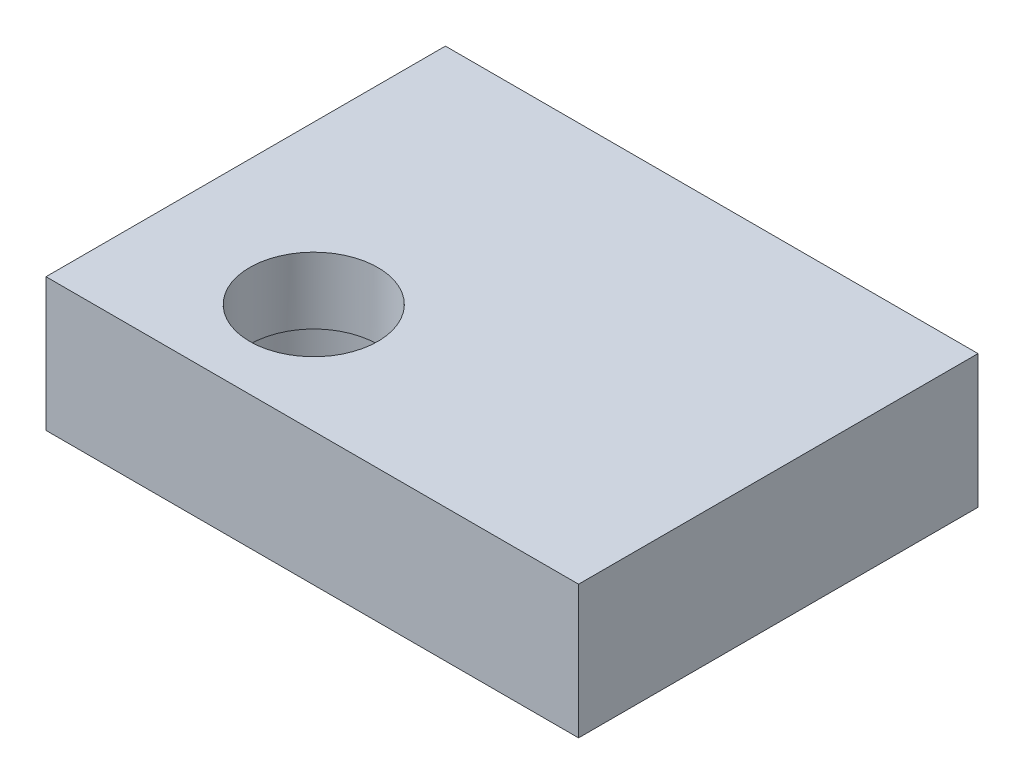
ISO-10303-21;
HEADER;
FILE_DESCRIPTION(('STEP AP214'),'2;1');
FILE_NAME('part.step','',(''),(''),'','','');
FILE_SCHEMA(('AUTOMOTIVE_DESIGN { 1 0 10303 214 1 1 1 1 }'));
ENDSEC;
DATA;
#1=APPLICATION_CONTEXT('core data for automotive mechanical design processes');
#2=APPLICATION_PROTOCOL_DEFINITION('international standard','automotive_design',2000,#1);
#3=PRODUCT_CONTEXT('',#1,'mechanical');
#4=PRODUCT('Part','Part','',(#3));
#5=PRODUCT_RELATED_PRODUCT_CATEGORY('part','',(#4));
#6=PRODUCT_DEFINITION_FORMATION('','',#4);
#7=PRODUCT_DEFINITION_CONTEXT('part definition',#1,'design');
#8=PRODUCT_DEFINITION('design','',#6,#7);
#9=PRODUCT_DEFINITION_SHAPE('','',#8);
#10=(LENGTH_UNIT() NAMED_UNIT(*) SI_UNIT(.MILLI.,.METRE.));
#11=(NAMED_UNIT(*) PLANE_ANGLE_UNIT() SI_UNIT($,.RADIAN.));
#12=(NAMED_UNIT(*) SI_UNIT($,.STERADIAN.) SOLID_ANGLE_UNIT());
#13=UNCERTAINTY_MEASURE_WITH_UNIT(LENGTH_MEASURE(1.E-05),#10,'distance_accuracy_value','');
#14=(GEOMETRIC_REPRESENTATION_CONTEXT(3) GLOBAL_UNCERTAINTY_ASSIGNED_CONTEXT((#13)) GLOBAL_UNIT_ASSIGNED_CONTEXT((#10,
#11,#12)) REPRESENTATION_CONTEXT('',''));
#15=CARTESIAN_POINT('',(0.,0.,0.));
#16=DIRECTION('',(0.,0.,1.));
#17=DIRECTION('',(1.,0.,0.));
#18=AXIS2_PLACEMENT_3D('',#15,#16,#17);
#19=CARTESIAN_POINT('',(20.,10.,15.));
#20=DIRECTION('',(-1.,0.,0.));
#21=DIRECTION('',(0.,0.,1.));
#22=AXIS2_PLACEMENT_3D('',#19,#20,#21);
#23=PLANE('',#22);
#24=DIRECTION('',(0.,0.,-1.));
#25=VECTOR('',#24,1.);
#26=CARTESIAN_POINT('',(20.,0.,15.));
#27=LINE('',#26,#25);
#28=CARTESIAN_POINT('',(20.,0.,15.));
#29=VERTEX_POINT('',#28);
#30=CARTESIAN_POINT('',(20.,0.,-15.));
#31=VERTEX_POINT('',#30);
#32=EDGE_CURVE('E117',#29,#31,#27,.T.);
#33=ORIENTED_EDGE('',*,*,#32,.T.);
#34=DIRECTION('',(0.,-1.,0.));
#35=VECTOR('',#34,1.);
#36=CARTESIAN_POINT('',(20.,10.,-15.));
#37=LINE('',#36,#35);
#38=CARTESIAN_POINT('',(20.,10.,-15.));
#39=VERTEX_POINT('',#38);
#40=EDGE_CURVE('E11',#39,#31,#37,.T.);
#41=ORIENTED_EDGE('',*,*,#40,.F.);
#42=DIRECTION('',(0.,0.,-1.));
#43=VECTOR('',#42,1.);
#44=CARTESIAN_POINT('',(20.,10.,15.));
#45=LINE('',#44,#43);
#46=CARTESIAN_POINT('',(20.,10.,15.));
#47=VERTEX_POINT('',#46);
#48=EDGE_CURVE('E100',#47,#39,#45,.T.);
#49=ORIENTED_EDGE('',*,*,#48,.F.);
#50=DIRECTION('',(0.,-1.,0.));
#51=VECTOR('',#50,1.);
#52=CARTESIAN_POINT('',(20.,10.,15.));
#53=LINE('',#52,#51);
#54=EDGE_CURVE('E113',#47,#29,#53,.T.);
#55=ORIENTED_EDGE('',*,*,#54,.T.);
#56=EDGE_LOOP('',(#33,#41,#49,#55));
#57=FACE_BOUND('',#56,.T.);
#58=ADVANCED_FACE('F47',(#57),#23,.F.);
#59=CARTESIAN_POINT('',(-20.,10.,-15.));
#60=DIRECTION('',(0.,0.,1.));
#61=DIRECTION('',(1.,0.,0.));
#62=AXIS2_PLACEMENT_3D('',#59,#60,#61);
#63=PLANE('',#62);
#64=DIRECTION('',(-1.,0.,0.));
#65=VECTOR('',#64,1.);
#66=CARTESIAN_POINT('',(-20.,0.,-15.));
#67=LINE('',#66,#65);
#68=CARTESIAN_POINT('',(-20.,0.,-15.));
#69=VERTEX_POINT('',#68);
#70=EDGE_CURVE('E105',#31,#69,#67,.T.);
#71=ORIENTED_EDGE('',*,*,#70,.T.);
#72=DIRECTION('',(0.,-1.,0.));
#73=VECTOR('',#72,1.);
#74=CARTESIAN_POINT('',(-20.,10.,-15.));
#75=LINE('',#74,#73);
#76=CARTESIAN_POINT('',(-20.,10.,-15.));
#77=VERTEX_POINT('',#76);
#78=EDGE_CURVE('E57',#77,#69,#75,.T.);
#79=ORIENTED_EDGE('',*,*,#78,.F.);
#80=DIRECTION('',(-1.,0.,0.));
#81=VECTOR('',#80,1.);
#82=CARTESIAN_POINT('',(-20.,10.,-15.));
#83=LINE('',#82,#81);
#84=EDGE_CURVE('E95',#39,#77,#83,.T.);
#85=ORIENTED_EDGE('',*,*,#84,.F.);
#86=ORIENTED_EDGE('',*,*,#40,.T.);
#87=EDGE_LOOP('',(#71,#79,#85,#86));
#88=FACE_BOUND('',#87,.T.);
#89=ADVANCED_FACE('F104',(#88),#63,.F.);
#90=CARTESIAN_POINT('',(-20.,10.,15.));
#91=DIRECTION('',(1.,0.,0.));
#92=DIRECTION('',(0.,0.,-1.));
#93=AXIS2_PLACEMENT_3D('',#90,#91,#92);
#94=PLANE('',#93);
#95=DIRECTION('',(0.,0.,1.));
#96=VECTOR('',#95,1.);
#97=CARTESIAN_POINT('',(-20.,0.,15.));
#98=LINE('',#97,#96);
#99=CARTESIAN_POINT('',(-20.,0.,15.));
#100=VERTEX_POINT('',#99);
#101=EDGE_CURVE('E82',#69,#100,#98,.T.);
#102=ORIENTED_EDGE('',*,*,#101,.T.);
#103=DIRECTION('',(0.,-1.,0.));
#104=VECTOR('',#103,1.);
#105=CARTESIAN_POINT('',(-20.,10.,15.));
#106=LINE('',#105,#104);
#107=CARTESIAN_POINT('',(-20.,10.,15.));
#108=VERTEX_POINT('',#107);
#109=EDGE_CURVE('E107',#108,#100,#106,.T.);
#110=ORIENTED_EDGE('',*,*,#109,.F.);
#111=DIRECTION('',(0.,0.,1.));
#112=VECTOR('',#111,1.);
#113=CARTESIAN_POINT('',(-20.,10.,15.));
#114=LINE('',#113,#112);
#115=EDGE_CURVE('E98',#77,#108,#114,.T.);
#116=ORIENTED_EDGE('',*,*,#115,.F.);
#117=ORIENTED_EDGE('',*,*,#78,.T.);
#118=EDGE_LOOP('',(#102,#110,#116,#117));
#119=FACE_BOUND('',#118,.T.);
#120=ADVANCED_FACE('F109',(#119),#94,.F.);
#121=CARTESIAN_POINT('',(-20.,10.,15.));
#122=DIRECTION('',(0.,0.,-1.));
#123=DIRECTION('',(-1.,0.,0.));
#124=AXIS2_PLACEMENT_3D('',#121,#122,#123);
#125=PLANE('',#124);
#126=DIRECTION('',(1.,0.,0.));
#127=VECTOR('',#126,1.);
#128=CARTESIAN_POINT('',(-20.,0.,15.));
#129=LINE('',#128,#127);
#130=EDGE_CURVE('E88',#100,#29,#129,.T.);
#131=ORIENTED_EDGE('',*,*,#130,.T.);
#132=ORIENTED_EDGE('',*,*,#54,.F.);
#133=DIRECTION('',(1.,0.,0.));
#134=VECTOR('',#133,1.);
#135=CARTESIAN_POINT('',(-20.,10.,15.));
#136=LINE('',#135,#134);
#137=EDGE_CURVE('E65',#108,#47,#136,.T.);
#138=ORIENTED_EDGE('',*,*,#137,.F.);
#139=ORIENTED_EDGE('',*,*,#109,.T.);
#140=EDGE_LOOP('',(#131,#132,#138,#139));
#141=FACE_BOUND('',#140,.T.);
#142=ADVANCED_FACE('F131',(#141),#125,.F.);
#143=CARTESIAN_POINT('',(0.,10.,0.));
#144=DIRECTION('',(0.,-1.,0.));
#145=DIRECTION('',(0.,0.,-1.));
#146=AXIS2_PLACEMENT_3D('',#143,#144,#145);
#147=PLANE('',#146);
#148=CARTESIAN_POINT('',(-8.14,10.,6.75));
#149=DIRECTION('',(0.,1.,0.));
#150=DIRECTION('',(0.,0.,1.));
#151=AXIS2_PLACEMENT_3D('',#148,#149,#150);
#152=CIRCLE('',#151,4.8125);
#153=CARTESIAN_POINT('',(-8.14,10.,11.5625));
#154=VERTEX_POINT('',#153);
#155=EDGE_CURVE('E169',#154,#154,#152,.T.);
#156=ORIENTED_EDGE('',*,*,#155,.F.);
#157=EDGE_LOOP('',(#156));
#158=FACE_BOUND('',#157,.T.);
#159=ORIENTED_EDGE('',*,*,#48,.T.);
#160=ORIENTED_EDGE('',*,*,#84,.T.);
#161=ORIENTED_EDGE('',*,*,#115,.T.);
#162=ORIENTED_EDGE('',*,*,#137,.T.);
#163=EDGE_LOOP('',(#159,#160,#161,#162));
#164=FACE_BOUND('',#163,.T.);
#165=ADVANCED_FACE('F96',(#158,#164),#147,.F.);
#166=CARTESIAN_POINT('',(0.,0.,0.));
#167=DIRECTION('',(0.,-1.,0.));
#168=DIRECTION('',(0.,0.,-1.));
#169=AXIS2_PLACEMENT_3D('',#166,#167,#168);
#170=PLANE('',#169);
#171=CARTESIAN_POINT('',(-8.14,0.,6.75));
#172=DIRECTION('',(0.,-1.,0.));
#173=DIRECTION('',(0.,0.,-1.));
#174=AXIS2_PLACEMENT_3D('',#171,#172,#173);
#175=CIRCLE('',#174,6.3);
#176=CARTESIAN_POINT('',(-8.14,0.,0.449999999999997));
#177=VERTEX_POINT('',#176);
#178=EDGE_CURVE('E150',#177,#177,#175,.T.);
#179=ORIENTED_EDGE('',*,*,#178,.F.);
#180=EDGE_LOOP('',(#179));
#181=FACE_BOUND('',#180,.T.);
#182=CARTESIAN_POINT('',(-13.3333333333333,0.,-10.));
#183=DIRECTION('',(0.,-1.,0.));
#184=DIRECTION('',(0.,0.,-1.));
#185=AXIS2_PLACEMENT_3D('',#182,#183,#184);
#186=CIRCLE('',#185,2.);
#187=CARTESIAN_POINT('',(-13.3333333333333,0.,-12.));
#188=VERTEX_POINT('',#187);
#189=EDGE_CURVE('E158',#188,#188,#186,.T.);
#190=ORIENTED_EDGE('',*,*,#189,.F.);
#191=EDGE_LOOP('',(#190));
#192=FACE_BOUND('',#191,.T.);
#193=CARTESIAN_POINT('',(13.3333333333333,0.,-10.));
#194=DIRECTION('',(0.,-1.,0.));
#195=DIRECTION('',(0.,0.,1.));
#196=AXIS2_PLACEMENT_3D('',#193,#194,#195);
#197=CIRCLE('',#196,2.);
#198=CARTESIAN_POINT('',(13.3333333333333,0.,-8.));
#199=VERTEX_POINT('',#198);
#200=EDGE_CURVE('E142',#199,#199,#197,.T.);
#201=ORIENTED_EDGE('',*,*,#200,.F.);
#202=EDGE_LOOP('',(#201));
#203=FACE_BOUND('',#202,.T.);
#204=CARTESIAN_POINT('',(13.3333333333333,0.,10.));
#205=DIRECTION('',(0.,-1.,0.));
#206=DIRECTION('',(0.,0.,-1.));
#207=AXIS2_PLACEMENT_3D('',#204,#205,#206);
#208=CIRCLE('',#207,2.);
#209=CARTESIAN_POINT('',(13.3333333333333,0.,8.));
#210=VERTEX_POINT('',#209);
#211=EDGE_CURVE('E138',#210,#210,#208,.T.);
#212=ORIENTED_EDGE('',*,*,#211,.F.);
#213=EDGE_LOOP('',(#212));
#214=FACE_BOUND('',#213,.T.);
#215=ORIENTED_EDGE('',*,*,#32,.F.);
#216=ORIENTED_EDGE('',*,*,#130,.F.);
#217=ORIENTED_EDGE('',*,*,#101,.F.);
#218=ORIENTED_EDGE('',*,*,#70,.F.);
#219=EDGE_LOOP('',(#215,#216,#217,#218));
#220=FACE_BOUND('',#219,.T.);
#221=ADVANCED_FACE('F134',(#181,#192,#203,#214,#220),#170,.T.);
#222=CARTESIAN_POINT('',(13.3333333333333,5.,10.));
#223=DIRECTION('',(0.,-1.,0.));
#224=DIRECTION('',(0.,0.,-1.));
#225=AXIS2_PLACEMENT_3D('',#222,#223,#224);
#226=CYLINDRICAL_SURFACE('',#225,2.);
#227=CARTESIAN_POINT('',(13.3333333333333,5.,10.));
#228=DIRECTION('',(0.,-1.,0.));
#229=DIRECTION('',(0.,0.,-1.));
#230=AXIS2_PLACEMENT_3D('',#227,#228,#229);
#231=CIRCLE('',#230,2.);
#232=CARTESIAN_POINT('',(13.3333333333333,5.,8.));
#233=VERTEX_POINT('',#232);
#234=EDGE_CURVE('E121',#233,#233,#231,.T.);
#235=ORIENTED_EDGE('',*,*,#234,.F.);
#236=EDGE_LOOP('',(#235));
#237=FACE_BOUND('',#236,.T.);
#238=ORIENTED_EDGE('',*,*,#211,.T.);
#239=EDGE_LOOP('',(#238));
#240=FACE_BOUND('',#239,.T.);
#241=ADVANCED_FACE('F195',(#237,#240),#226,.F.);
#242=CARTESIAN_POINT('',(13.3333333333333,5.,10.));
#243=DIRECTION('',(0.,-1.,0.));
#244=DIRECTION('',(0.,0.,-1.));
#245=AXIS2_PLACEMENT_3D('',#242,#243,#244);
#246=PLANE('',#245);
#247=ORIENTED_EDGE('',*,*,#234,.T.);
#248=EDGE_LOOP('',(#247));
#249=FACE_BOUND('',#248,.T.);
#250=ADVANCED_FACE('F204',(#249),#246,.T.);
#251=CARTESIAN_POINT('',(13.3333333333333,5.,-10.));
#252=DIRECTION('',(0.,-1.,0.));
#253=DIRECTION('',(0.,0.,-1.));
#254=AXIS2_PLACEMENT_3D('',#251,#252,#253);
#255=CYLINDRICAL_SURFACE('',#254,2.);
#256=CARTESIAN_POINT('',(13.3333333333333,5.,-10.));
#257=DIRECTION('',(0.,-1.,0.));
#258=DIRECTION('',(0.,0.,1.));
#259=AXIS2_PLACEMENT_3D('',#256,#257,#258);
#260=CIRCLE('',#259,2.);
#261=CARTESIAN_POINT('',(13.3333333333333,5.,-8.));
#262=VERTEX_POINT('',#261);
#263=EDGE_CURVE('E162',#262,#262,#260,.T.);
#264=ORIENTED_EDGE('',*,*,#263,.F.);
#265=EDGE_LOOP('',(#264));
#266=FACE_BOUND('',#265,.T.);
#267=ORIENTED_EDGE('',*,*,#200,.T.);
#268=EDGE_LOOP('',(#267));
#269=FACE_BOUND('',#268,.T.);
#270=ADVANCED_FACE('F210',(#266,#269),#255,.F.);
#271=CARTESIAN_POINT('',(13.3333333333333,5.,-10.));
#272=DIRECTION('',(0.,1.,0.));
#273=DIRECTION('',(0.,0.,1.));
#274=AXIS2_PLACEMENT_3D('',#271,#272,#273);
#275=PLANE('',#274);
#276=ORIENTED_EDGE('',*,*,#263,.T.);
#277=EDGE_LOOP('',(#276));
#278=FACE_BOUND('',#277,.T.);
#279=ADVANCED_FACE('F268',(#278),#275,.F.);
#280=CARTESIAN_POINT('',(-13.3333333333333,5.,-10.));
#281=DIRECTION('',(0.,-1.,0.));
#282=DIRECTION('',(0.,0.,-1.));
#283=AXIS2_PLACEMENT_3D('',#280,#281,#282);
#284=CYLINDRICAL_SURFACE('',#283,2.);
#285=CARTESIAN_POINT('',(-13.3333333333333,5.,-10.));
#286=DIRECTION('',(0.,-1.,0.));
#287=DIRECTION('',(0.,0.,-1.));
#288=AXIS2_PLACEMENT_3D('',#285,#286,#287);
#289=CIRCLE('',#288,2.);
#290=CARTESIAN_POINT('',(-13.3333333333333,5.,-12.));
#291=VERTEX_POINT('',#290);
#292=EDGE_CURVE('E154',#291,#291,#289,.T.);
#293=ORIENTED_EDGE('',*,*,#292,.F.);
#294=EDGE_LOOP('',(#293));
#295=FACE_BOUND('',#294,.T.);
#296=ORIENTED_EDGE('',*,*,#189,.T.);
#297=EDGE_LOOP('',(#296));
#298=FACE_BOUND('',#297,.T.);
#299=ADVANCED_FACE('F259',(#295,#298),#284,.F.);
#300=CARTESIAN_POINT('',(-13.3333333333333,5.,-10.));
#301=DIRECTION('',(0.,-1.,0.));
#302=DIRECTION('',(0.,0.,-1.));
#303=AXIS2_PLACEMENT_3D('',#300,#301,#302);
#304=PLANE('',#303);
#305=ORIENTED_EDGE('',*,*,#292,.T.);
#306=EDGE_LOOP('',(#305));
#307=FACE_BOUND('',#306,.T.);
#308=ADVANCED_FACE('F189',(#307),#304,.T.);
#309=CARTESIAN_POINT('',(-8.14,5.,6.75));
#310=DIRECTION('',(0.,-1.,0.));
#311=DIRECTION('',(0.,0.,-1.));
#312=AXIS2_PLACEMENT_3D('',#309,#310,#311);
#313=CYLINDRICAL_SURFACE('',#312,6.3);
#314=CARTESIAN_POINT('',(-8.14,5.,6.75));
#315=DIRECTION('',(0.,-1.,0.));
#316=DIRECTION('',(0.,0.,-1.));
#317=AXIS2_PLACEMENT_3D('',#314,#315,#316);
#318=CIRCLE('',#317,6.3);
#319=CARTESIAN_POINT('',(-8.14,5.,0.449999999999997));
#320=VERTEX_POINT('',#319);
#321=EDGE_CURVE('E146',#320,#320,#318,.T.);
#322=ORIENTED_EDGE('',*,*,#321,.F.);
#323=EDGE_LOOP('',(#322));
#324=FACE_BOUND('',#323,.T.);
#325=ORIENTED_EDGE('',*,*,#178,.T.);
#326=EDGE_LOOP('',(#325));
#327=FACE_BOUND('',#326,.T.);
#328=ADVANCED_FACE('F183',(#324,#327),#313,.F.);
#329=CARTESIAN_POINT('',(-8.14,5.,6.75));
#330=DIRECTION('',(0.,-1.,0.));
#331=DIRECTION('',(0.,0.,-1.));
#332=AXIS2_PLACEMENT_3D('',#329,#330,#331);
#333=PLANE('',#332);
#334=CARTESIAN_POINT('',(-8.14,5.,6.75));
#335=DIRECTION('',(0.,-1.,0.));
#336=DIRECTION('',(0.,0.,-1.));
#337=AXIS2_PLACEMENT_3D('',#334,#335,#336);
#338=CIRCLE('',#337,4.8125);
#339=CARTESIAN_POINT('',(-8.14,5.,1.9375));
#340=VERTEX_POINT('',#339);
#341=EDGE_CURVE('E50',#340,#340,#338,.T.);
#342=ORIENTED_EDGE('',*,*,#341,.F.);
#343=EDGE_LOOP('',(#342));
#344=FACE_BOUND('',#343,.T.);
#345=ORIENTED_EDGE('',*,*,#321,.T.);
#346=EDGE_LOOP('',(#345));
#347=FACE_BOUND('',#346,.T.);
#348=ADVANCED_FACE('F180',(#344,#347),#333,.T.);
#349=CARTESIAN_POINT('',(-8.14,-13.611805537841,6.75));
#350=DIRECTION('',(0.,1.,0.));
#351=DIRECTION('',(0.,0.,1.));
#352=AXIS2_PLACEMENT_3D('',#349,#350,#351);
#353=CYLINDRICAL_SURFACE('',#352,4.8125);
#354=ORIENTED_EDGE('',*,*,#341,.T.);
#355=EDGE_LOOP('',(#354));
#356=FACE_BOUND('',#355,.T.);
#357=ORIENTED_EDGE('',*,*,#155,.T.);
#358=EDGE_LOOP('',(#357));
#359=FACE_BOUND('',#358,.T.);
#360=ADVANCED_FACE('F178',(#356,#359),#353,.F.);
#361=CLOSED_SHELL('',(#58,#89,#120,#142,#165,#221,#241,#250,#270,#279,#299,#308,#328,#348,#360));
#362=MANIFOLD_SOLID_BREP('B2',#361);
#363=ADVANCED_BREP_SHAPE_REPRESENTATION('',(#18,#362),#14);
#364=SHAPE_DEFINITION_REPRESENTATION(#9,#363);
ENDSEC;
END-ISO-10303-21;
